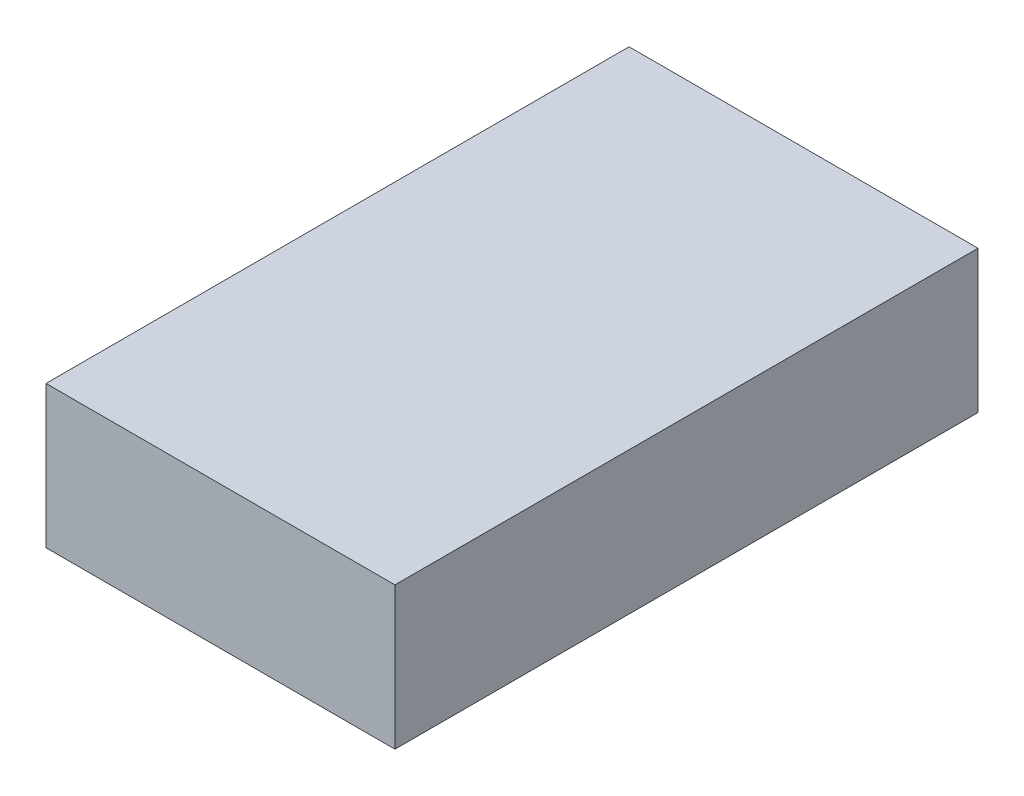
ISO-10303-21;
HEADER;
FILE_DESCRIPTION(('STEP AP214'),'2;1');
FILE_NAME('part.step','',(''),(''),'','','');
FILE_SCHEMA(('AUTOMOTIVE_DESIGN { 1 0 10303 214 1 1 1 1 }'));
ENDSEC;
DATA;
#1=APPLICATION_CONTEXT('core data for automotive mechanical design processes');
#2=APPLICATION_PROTOCOL_DEFINITION('international standard','automotive_design',2000,#1);
#3=PRODUCT_CONTEXT('',#1,'mechanical');
#4=PRODUCT('Part','Part','',(#3));
#5=PRODUCT_RELATED_PRODUCT_CATEGORY('part','',(#4));
#6=PRODUCT_DEFINITION_FORMATION('','',#4);
#7=PRODUCT_DEFINITION_CONTEXT('part definition',#1,'design');
#8=PRODUCT_DEFINITION('design','',#6,#7);
#9=PRODUCT_DEFINITION_SHAPE('','',#8);
#10=(LENGTH_UNIT() NAMED_UNIT(*) SI_UNIT(.MILLI.,.METRE.));
#11=(NAMED_UNIT(*) PLANE_ANGLE_UNIT() SI_UNIT($,.RADIAN.));
#12=(NAMED_UNIT(*) SI_UNIT($,.STERADIAN.) SOLID_ANGLE_UNIT());
#13=UNCERTAINTY_MEASURE_WITH_UNIT(LENGTH_MEASURE(1.E-05),#10,'distance_accuracy_value','');
#14=(GEOMETRIC_REPRESENTATION_CONTEXT(3) GLOBAL_UNCERTAINTY_ASSIGNED_CONTEXT((#13)) GLOBAL_UNIT_ASSIGNED_CONTEXT((#10,
#11,#12)) REPRESENTATION_CONTEXT('',''));
#15=CARTESIAN_POINT('',(0.,0.,0.));
#16=DIRECTION('',(0.,0.,1.));
#17=DIRECTION('',(1.,0.,0.));
#18=AXIS2_PLACEMENT_3D('',#15,#16,#17);
#19=CARTESIAN_POINT('',(0.,31.,0.));
#20=DIRECTION('',(1.,0.,0.));
#21=DIRECTION('',(0.,0.,-1.));
#22=AXIS2_PLACEMENT_3D('',#19,#20,#21);
#23=PLANE('',#22);
#24=DIRECTION('',(0.,0.,1.));
#25=VECTOR('',#24,1.);
#26=CARTESIAN_POINT('',(0.,0.,0.));
#27=LINE('',#26,#25);
#28=CARTESIAN_POINT('',(0.,0.,-127.));
#29=VERTEX_POINT('',#28);
#30=CARTESIAN_POINT('',(0.,0.,0.));
#31=VERTEX_POINT('',#30);
#32=EDGE_CURVE('E113',#29,#31,#27,.T.);
#33=ORIENTED_EDGE('',*,*,#32,.T.);
#34=DIRECTION('',(0.,-1.,0.));
#35=VECTOR('',#34,1.);
#36=CARTESIAN_POINT('',(0.,31.,0.));
#37=LINE('',#36,#35);
#38=CARTESIAN_POINT('',(0.,31.,0.));
#39=VERTEX_POINT('',#38);
#40=EDGE_CURVE('E11',#39,#31,#37,.T.);
#41=ORIENTED_EDGE('',*,*,#40,.F.);
#42=DIRECTION('',(0.,0.,1.));
#43=VECTOR('',#42,1.);
#44=CARTESIAN_POINT('',(0.,31.,0.));
#45=LINE('',#44,#43);
#46=CARTESIAN_POINT('',(0.,31.,-127.));
#47=VERTEX_POINT('',#46);
#48=EDGE_CURVE('E97',#47,#39,#45,.T.);
#49=ORIENTED_EDGE('',*,*,#48,.F.);
#50=DIRECTION('',(0.,-1.,0.));
#51=VECTOR('',#50,1.);
#52=CARTESIAN_POINT('',(0.,31.,-127.));
#53=LINE('',#52,#51);
#54=EDGE_CURVE('E109',#47,#29,#53,.T.);
#55=ORIENTED_EDGE('',*,*,#54,.T.);
#56=EDGE_LOOP('',(#33,#41,#49,#55));
#57=FACE_BOUND('',#56,.T.);
#58=ADVANCED_FACE('F45',(#57),#23,.F.);
#59=CARTESIAN_POINT('',(0.,31.,0.));
#60=DIRECTION('',(0.,0.,-1.));
#61=DIRECTION('',(-1.,0.,0.));
#62=AXIS2_PLACEMENT_3D('',#59,#60,#61);
#63=PLANE('',#62);
#64=DIRECTION('',(1.,0.,0.));
#65=VECTOR('',#64,1.);
#66=CARTESIAN_POINT('',(0.,0.,0.));
#67=LINE('',#66,#65);
#68=CARTESIAN_POINT('',(76.,0.,0.));
#69=VERTEX_POINT('',#68);
#70=EDGE_CURVE('E102',#31,#69,#67,.T.);
#71=ORIENTED_EDGE('',*,*,#70,.T.);
#72=DIRECTION('',(0.,-1.,0.));
#73=VECTOR('',#72,1.);
#74=CARTESIAN_POINT('',(76.,31.,0.));
#75=LINE('',#74,#73);
#76=CARTESIAN_POINT('',(76.,31.,0.));
#77=VERTEX_POINT('',#76);
#78=EDGE_CURVE('E54',#77,#69,#75,.T.);
#79=ORIENTED_EDGE('',*,*,#78,.F.);
#80=DIRECTION('',(1.,0.,0.));
#81=VECTOR('',#80,1.);
#82=CARTESIAN_POINT('',(0.,31.,0.));
#83=LINE('',#82,#81);
#84=EDGE_CURVE('E92',#39,#77,#83,.T.);
#85=ORIENTED_EDGE('',*,*,#84,.F.);
#86=ORIENTED_EDGE('',*,*,#40,.T.);
#87=EDGE_LOOP('',(#71,#79,#85,#86));
#88=FACE_BOUND('',#87,.T.);
#89=ADVANCED_FACE('F101',(#88),#63,.F.);
#90=CARTESIAN_POINT('',(76.,31.,0.));
#91=DIRECTION('',(-1.,0.,0.));
#92=DIRECTION('',(0.,0.,1.));
#93=AXIS2_PLACEMENT_3D('',#90,#91,#92);
#94=PLANE('',#93);
#95=DIRECTION('',(0.,0.,-1.));
#96=VECTOR('',#95,1.);
#97=CARTESIAN_POINT('',(76.,0.,0.));
#98=LINE('',#97,#96);
#99=CARTESIAN_POINT('',(76.,0.,-127.));
#100=VERTEX_POINT('',#99);
#101=EDGE_CURVE('E79',#69,#100,#98,.T.);
#102=ORIENTED_EDGE('',*,*,#101,.T.);
#103=DIRECTION('',(0.,-1.,0.));
#104=VECTOR('',#103,1.);
#105=CARTESIAN_POINT('',(76.,31.,-127.));
#106=LINE('',#105,#104);
#107=CARTESIAN_POINT('',(76.,31.,-127.));
#108=VERTEX_POINT('',#107);
#109=EDGE_CURVE('E104',#108,#100,#106,.T.);
#110=ORIENTED_EDGE('',*,*,#109,.F.);
#111=DIRECTION('',(0.,0.,-1.));
#112=VECTOR('',#111,1.);
#113=CARTESIAN_POINT('',(76.,31.,0.));
#114=LINE('',#113,#112);
#115=EDGE_CURVE('E95',#77,#108,#114,.T.);
#116=ORIENTED_EDGE('',*,*,#115,.F.);
#117=ORIENTED_EDGE('',*,*,#78,.T.);
#118=EDGE_LOOP('',(#102,#110,#116,#117));
#119=FACE_BOUND('',#118,.T.);
#120=ADVANCED_FACE('F105',(#119),#94,.F.);
#121=CARTESIAN_POINT('',(0.,31.,-127.));
#122=DIRECTION('',(0.,0.,1.));
#123=DIRECTION('',(1.,0.,0.));
#124=AXIS2_PLACEMENT_3D('',#121,#122,#123);
#125=PLANE('',#124);
#126=DIRECTION('',(-1.,0.,0.));
#127=VECTOR('',#126,1.);
#128=CARTESIAN_POINT('',(0.,0.,-127.));
#129=LINE('',#128,#127);
#130=EDGE_CURVE('E85',#100,#29,#129,.T.);
#131=ORIENTED_EDGE('',*,*,#130,.T.);
#132=ORIENTED_EDGE('',*,*,#54,.F.);
#133=DIRECTION('',(-1.,0.,0.));
#134=VECTOR('',#133,1.);
#135=CARTESIAN_POINT('',(0.,31.,-127.));
#136=LINE('',#135,#134);
#137=EDGE_CURVE('E62',#108,#47,#136,.T.);
#138=ORIENTED_EDGE('',*,*,#137,.F.);
#139=ORIENTED_EDGE('',*,*,#109,.T.);
#140=EDGE_LOOP('',(#131,#132,#138,#139));
#141=FACE_BOUND('',#140,.T.);
#142=ADVANCED_FACE('F126',(#141),#125,.F.);
#143=CARTESIAN_POINT('',(0.,31.,0.));
#144=DIRECTION('',(0.,-1.,0.));
#145=DIRECTION('',(0.,0.,-1.));
#146=AXIS2_PLACEMENT_3D('',#143,#144,#145);
#147=PLANE('',#146);
#148=ORIENTED_EDGE('',*,*,#48,.T.);
#149=ORIENTED_EDGE('',*,*,#84,.T.);
#150=ORIENTED_EDGE('',*,*,#115,.T.);
#151=ORIENTED_EDGE('',*,*,#137,.T.);
#152=EDGE_LOOP('',(#148,#149,#150,#151));
#153=FACE_BOUND('',#152,.T.);
#154=ADVANCED_FACE('F93',(#153),#147,.F.);
#155=CARTESIAN_POINT('',(0.,0.,0.));
#156=DIRECTION('',(0.,-1.,0.));
#157=DIRECTION('',(0.,0.,-1.));
#158=AXIS2_PLACEMENT_3D('',#155,#156,#157);
#159=PLANE('',#158);
#160=ORIENTED_EDGE('',*,*,#32,.F.);
#161=ORIENTED_EDGE('',*,*,#130,.F.);
#162=ORIENTED_EDGE('',*,*,#101,.F.);
#163=ORIENTED_EDGE('',*,*,#70,.F.);
#164=EDGE_LOOP('',(#160,#161,#162,#163));
#165=FACE_BOUND('',#164,.T.);
#166=ADVANCED_FACE('F129',(#165),#159,.T.);
#167=CLOSED_SHELL('',(#58,#89,#120,#142,#154,#166));
#168=MANIFOLD_SOLID_BREP('B2',#167);
#169=ADVANCED_BREP_SHAPE_REPRESENTATION('',(#18,#168),#14);
#170=SHAPE_DEFINITION_REPRESENTATION(#9,#169);
ENDSEC;
END-ISO-10303-21;
